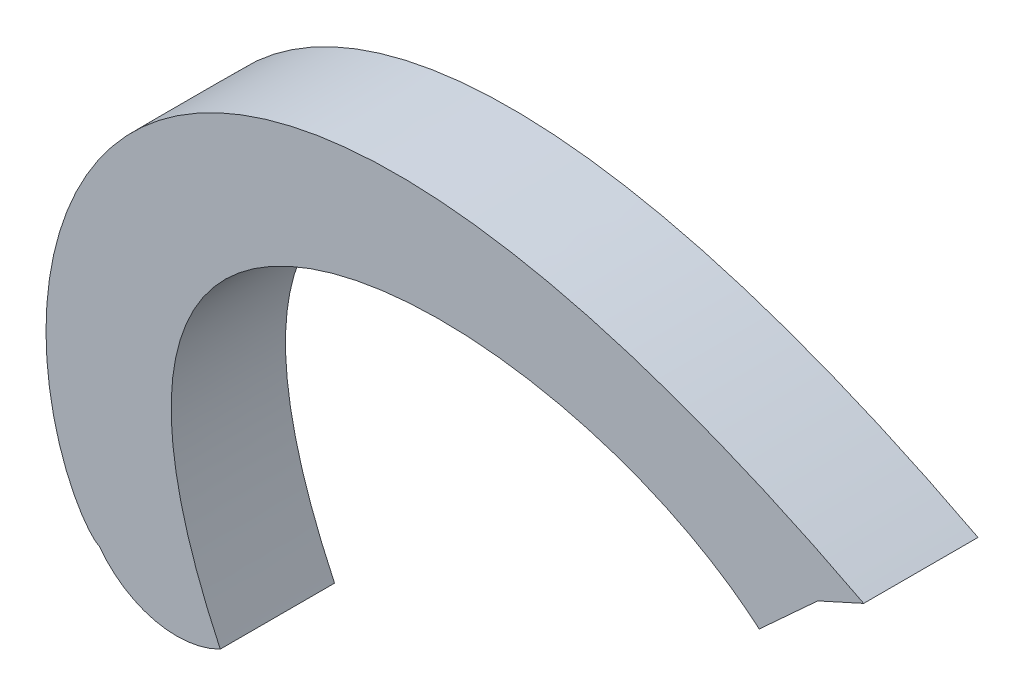
ISO-10303-21;
HEADER;
FILE_DESCRIPTION(('STEP AP214'),'2;1');
FILE_NAME('part.step','',(''),(''),'','','');
FILE_SCHEMA(('AUTOMOTIVE_DESIGN { 1 0 10303 214 1 1 1 1 }'));
ENDSEC;
DATA;
#1=APPLICATION_CONTEXT('core data for automotive mechanical design processes');
#2=APPLICATION_PROTOCOL_DEFINITION('international standard','automotive_design',2000,#1);
#3=PRODUCT_CONTEXT('',#1,'mechanical');
#4=PRODUCT('Part','Part','',(#3));
#5=PRODUCT_RELATED_PRODUCT_CATEGORY('part','',(#4));
#6=PRODUCT_DEFINITION_FORMATION('','',#4);
#7=PRODUCT_DEFINITION_CONTEXT('part definition',#1,'design');
#8=PRODUCT_DEFINITION('design','',#6,#7);
#9=PRODUCT_DEFINITION_SHAPE('','',#8);
#10=(LENGTH_UNIT() NAMED_UNIT(*) SI_UNIT(.MILLI.,.METRE.));
#11=(NAMED_UNIT(*) PLANE_ANGLE_UNIT() SI_UNIT($,.RADIAN.));
#12=(NAMED_UNIT(*) SI_UNIT($,.STERADIAN.) SOLID_ANGLE_UNIT());
#13=UNCERTAINTY_MEASURE_WITH_UNIT(LENGTH_MEASURE(1.E-05),#10,'distance_accuracy_value','');
#14=(GEOMETRIC_REPRESENTATION_CONTEXT(3) GLOBAL_UNCERTAINTY_ASSIGNED_CONTEXT((#13)) GLOBAL_UNIT_ASSIGNED_CONTEXT((#10,
#11,#12)) REPRESENTATION_CONTEXT('',''));
#15=CARTESIAN_POINT('',(0.,0.,0.));
#16=DIRECTION('',(0.,0.,1.));
#17=DIRECTION('',(1.,0.,0.));
#18=AXIS2_PLACEMENT_3D('',#15,#16,#17);
#19=CARTESIAN_POINT('',(-5.88915419968377,-15.9601737152074,13.8159769764135));
#20=CARTESIAN_POINT('',(-36.9486176451294,49.4724972070391,13.8159769764135));
#21=CARTESIAN_POINT('',(41.5171833928002,52.4811360395553,13.8159769764135));
#22=CARTESIAN_POINT('',(72.5490315517939,25.7975068878671,13.8159769764135));
#23=B_SPLINE_CURVE_WITH_KNOTS('',3,(#19,#20,#21,#22),.UNSPECIFIED.,.F.,.F.,(4,4),(0.,1.),.UNSPECIFIED.);
#24=DIRECTION('',(0.,0.,-1.));
#25=VECTOR('',#24,1.);
#26=SURFACE_OF_LINEAR_EXTRUSION('',#23,#25);
#27=CARTESIAN_POINT('',(-5.88915419968377,-15.9601737152074,-2.81602302358649));
#28=CARTESIAN_POINT('',(-36.9486176451294,49.4724972070391,-2.81602302358649));
#29=CARTESIAN_POINT('',(41.5171833928002,52.4811360395553,-2.81602302358649));
#30=CARTESIAN_POINT('',(72.5490315517939,25.7975068878671,-2.81602302358649));
#31=B_SPLINE_CURVE_WITH_KNOTS('',3,(#27,#28,#29,#30),.UNSPECIFIED.,.F.,.F.,(4,4),(0.,1.),.UNSPECIFIED.);
#32=CARTESIAN_POINT('',(-5.88915419968378,-15.9601737152074,-2.81602302358649));
#33=VERTEX_POINT('',#32);
#34=CARTESIAN_POINT('',(72.5490315517939,25.7975068878671,-2.81602302358649));
#35=VERTEX_POINT('',#34);
#36=EDGE_CURVE('E150',#33,#35,#31,.T.);
#37=ORIENTED_EDGE('',*,*,#36,.T.);
#38=DIRECTION('',(0.,0.,-1.));
#39=VECTOR('',#38,1.);
#40=CARTESIAN_POINT('',(72.5490315517939,25.7975068878671,13.8159769764135));
#41=LINE('',#40,#39);
#42=CARTESIAN_POINT('',(72.5490315517939,25.7975068878671,13.8159769764135));
#43=VERTEX_POINT('',#42);
#44=EDGE_CURVE('E11',#43,#35,#41,.T.);
#45=ORIENTED_EDGE('',*,*,#44,.F.);
#46=CARTESIAN_POINT('',(-5.88915419968378,-15.9601737152074,13.8159769764135));
#47=VERTEX_POINT('',#46);
#48=EDGE_CURVE('E166',#47,#43,#23,.T.);
#49=ORIENTED_EDGE('',*,*,#48,.F.);
#50=DIRECTION('',(0.,0.,-1.));
#51=VECTOR('',#50,1.);
#52=CARTESIAN_POINT('',(-5.88915419968378,-15.9601737152074,13.8159769764135));
#53=LINE('',#52,#51);
#54=EDGE_CURVE('E121',#47,#33,#53,.T.);
#55=ORIENTED_EDGE('',*,*,#54,.T.);
#56=EDGE_LOOP('',(#37,#45,#49,#55));
#57=FACE_BOUND('',#56,.T.);
#58=ADVANCED_FACE('F45',(#57),#26,.F.);
#59=CARTESIAN_POINT('',(72.5490315517939,25.7975068878671,13.8159769764135));
#60=DIRECTION('',(-0.675571462147576,0.737294513428512,0.));
#61=DIRECTION('',(-0.737294513428512,-0.675571462147576,0.));
#62=AXIS2_PLACEMENT_3D('',#59,#60,#61);
#63=PLANE('',#62);
#64=DIRECTION('',(0.737294513428512,0.675571462147576,0.));
#65=VECTOR('',#64,1.);
#66=CARTESIAN_POINT('',(72.5490315517939,25.7975068878671,-2.81602302358649));
#67=LINE('',#66,#65);
#68=CARTESIAN_POINT('',(81.0628593167846,33.5985944680816,-2.81602302358649));
#69=VERTEX_POINT('',#68);
#70=EDGE_CURVE('E144',#35,#69,#67,.T.);
#71=ORIENTED_EDGE('',*,*,#70,.T.);
#72=DIRECTION('',(0.,0.,-1.));
#73=VECTOR('',#72,1.);
#74=CARTESIAN_POINT('',(81.0628593167846,33.5985944680816,13.8159769764135));
#75=LINE('',#74,#73);
#76=CARTESIAN_POINT('',(81.0628593167846,33.5985944680816,13.8159769764135));
#77=VERTEX_POINT('',#76);
#78=EDGE_CURVE('E55',#77,#69,#75,.T.);
#79=ORIENTED_EDGE('',*,*,#78,.F.);
#80=DIRECTION('',(0.737294513428512,0.675571462147576,0.));
#81=VECTOR('',#80,1.);
#82=CARTESIAN_POINT('',(72.5490315517939,25.7975068878671,13.8159769764135));
#83=LINE('',#82,#81);
#84=EDGE_CURVE('E97',#43,#77,#83,.T.);
#85=ORIENTED_EDGE('',*,*,#84,.F.);
#86=ORIENTED_EDGE('',*,*,#44,.T.);
#87=EDGE_LOOP('',(#71,#79,#85,#86));
#88=FACE_BOUND('',#87,.T.);
#89=ADVANCED_FACE('F138',(#88),#63,.F.);
#90=CARTESIAN_POINT('',(81.0628593167846,33.5985944680816,13.8159769764135));
#91=DIRECTION('',(-0.412575858176279,0.910923246629543,0.));
#92=DIRECTION('',(-0.910923246629543,-0.412575858176279,0.));
#93=AXIS2_PLACEMENT_3D('',#90,#91,#92);
#94=PLANE('',#93);
#95=DIRECTION('',(0.910923246629543,0.412575858176279,0.));
#96=VECTOR('',#95,1.);
#97=CARTESIAN_POINT('',(81.0628593167846,33.5985944680816,-2.81602302358649));
#98=LINE('',#97,#96);
#99=CARTESIAN_POINT('',(87.7515955527034,36.6280605650987,-2.81602302358649));
#100=VERTEX_POINT('',#99);
#101=EDGE_CURVE('E113',#69,#100,#98,.T.);
#102=ORIENTED_EDGE('',*,*,#101,.T.);
#103=DIRECTION('',(0.,0.,-1.));
#104=VECTOR('',#103,1.);
#105=CARTESIAN_POINT('',(87.7515955527034,36.6280605650987,13.8159769764135));
#106=LINE('',#105,#104);
#107=CARTESIAN_POINT('',(87.7515955527034,36.6280605650987,13.8159769764135));
#108=VERTEX_POINT('',#107);
#109=EDGE_CURVE('E110',#108,#100,#106,.T.);
#110=ORIENTED_EDGE('',*,*,#109,.F.);
#111=DIRECTION('',(0.910923246629543,0.412575858176279,0.));
#112=VECTOR('',#111,1.);
#113=CARTESIAN_POINT('',(81.0628593167846,33.5985944680816,13.8159769764135));
#114=LINE('',#113,#112);
#115=EDGE_CURVE('E101',#77,#108,#114,.T.);
#116=ORIENTED_EDGE('',*,*,#115,.F.);
#117=ORIENTED_EDGE('',*,*,#78,.T.);
#118=EDGE_LOOP('',(#102,#110,#116,#117));
#119=FACE_BOUND('',#118,.T.);
#120=ADVANCED_FACE('F111',(#119),#94,.F.);
#121=CARTESIAN_POINT('',(87.7515955527034,36.6280605650987,13.8159769764135));
#122=CARTESIAN_POINT('',(-22.2952615594618,93.8948110954645,13.8159769764135));
#123=CARTESIAN_POINT('',(-48.9360166501118,23.144332876586,13.8159769764135));
#124=CARTESIAN_POINT('',(-27.7899428822048,-9.99592826001691,13.8159769764135));
#125=CARTESIAN_POINT('',(-23.4719389836452,-11.8005988182349,13.8159769764135));
#126=B_SPLINE_CURVE_WITH_KNOTS('',4,(#121,#122,#123,#124,#125),.UNSPECIFIED.,.F.,.F.,(5,5),(0.,
1.),.UNSPECIFIED.);
#127=DIRECTION('',(0.,0.,-1.));
#128=VECTOR('',#127,1.);
#129=SURFACE_OF_LINEAR_EXTRUSION('',#126,#128);
#130=CARTESIAN_POINT('',(87.7515955527034,36.6280605650987,-2.81602302358649));
#131=CARTESIAN_POINT('',(-22.2952615594618,93.8948110954645,-2.81602302358649));
#132=CARTESIAN_POINT('',(-48.9360166501118,23.144332876586,-2.81602302358649));
#133=CARTESIAN_POINT('',(-27.7899428822048,-9.99592826001691,-2.81602302358649));
#134=CARTESIAN_POINT('',(-23.4719389836452,-11.8005988182349,-2.81602302358649));
#135=B_SPLINE_CURVE_WITH_KNOTS('',4,(#130,#131,#132,#133,#134),.UNSPECIFIED.,.F.,.F.,(5,5),(0.,
1.),.UNSPECIFIED.);
#136=CARTESIAN_POINT('',(-23.4719389836452,-11.8005988182349,-2.81602302358649));
#137=VERTEX_POINT('',#136);
#138=EDGE_CURVE('E83',#100,#137,#135,.T.);
#139=ORIENTED_EDGE('',*,*,#138,.T.);
#140=DIRECTION('',(0.,0.,-1.));
#141=VECTOR('',#140,1.);
#142=CARTESIAN_POINT('',(-23.4719389836452,-11.8005988182349,13.8159769764135));
#143=LINE('',#142,#141);
#144=CARTESIAN_POINT('',(-23.4719389836452,-11.8005988182349,13.8159769764135));
#145=VERTEX_POINT('',#144);
#146=EDGE_CURVE('E115',#145,#137,#143,.T.);
#147=ORIENTED_EDGE('',*,*,#146,.F.);
#148=EDGE_CURVE('E105',#108,#145,#126,.T.);
#149=ORIENTED_EDGE('',*,*,#148,.F.);
#150=ORIENTED_EDGE('',*,*,#109,.T.);
#151=EDGE_LOOP('',(#139,#147,#149,#150));
#152=FACE_BOUND('',#151,.T.);
#153=ADVANCED_FACE('F117',(#152),#129,.F.);
#154=CARTESIAN_POINT('',(-12.2268575605098,-3.5084883612498,13.8159769764135));
#155=DIRECTION('',(0.,0.,-1.));
#156=DIRECTION('',(-1.,0.,0.));
#157=AXIS2_PLACEMENT_3D('',#154,#155,#156);
#158=CYLINDRICAL_SURFACE('',#157,13.9717912968878);
#159=CARTESIAN_POINT('',(-12.2268575605098,-3.5084883612498,-2.81602302358649));
#160=DIRECTION('',(0.,0.,1.));
#161=DIRECTION('',(1.,0.,0.));
#162=AXIS2_PLACEMENT_3D('',#159,#160,#161);
#163=CIRCLE('',#162,13.9717912968878);
#164=EDGE_CURVE('E89',#137,#33,#163,.T.);
#165=ORIENTED_EDGE('',*,*,#164,.T.);
#166=ORIENTED_EDGE('',*,*,#54,.F.);
#167=CARTESIAN_POINT('',(-12.2268575605098,-3.5084883612498,13.8159769764135));
#168=DIRECTION('',(0.,0.,1.));
#169=DIRECTION('',(1.,0.,0.));
#170=AXIS2_PLACEMENT_3D('',#167,#168,#169);
#171=CIRCLE('',#170,13.9717912968878);
#172=EDGE_CURVE('E63',#145,#47,#171,.T.);
#173=ORIENTED_EDGE('',*,*,#172,.F.);
#174=ORIENTED_EDGE('',*,*,#146,.T.);
#175=EDGE_LOOP('',(#165,#166,#173,#174));
#176=FACE_BOUND('',#175,.T.);
#177=ADVANCED_FACE('F135',(#176),#158,.T.);
#178=CARTESIAN_POINT('',(10.0456968243903,39.4622791140554,13.8159769764135));
#179=DIRECTION('',(0.,0.,1.));
#180=DIRECTION('',(1.,0.,0.));
#181=AXIS2_PLACEMENT_3D('',#178,#179,#180);
#182=PLANE('',#181);
#183=ORIENTED_EDGE('',*,*,#48,.T.);
#184=ORIENTED_EDGE('',*,*,#84,.T.);
#185=ORIENTED_EDGE('',*,*,#115,.T.);
#186=ORIENTED_EDGE('',*,*,#148,.T.);
#187=ORIENTED_EDGE('',*,*,#172,.T.);
#188=EDGE_LOOP('',(#183,#184,#185,#186,#187));
#189=FACE_BOUND('',#188,.T.);
#190=ADVANCED_FACE('F103',(#189),#182,.T.);
#191=CARTESIAN_POINT('',(10.0456968243903,39.4622791140554,-2.81602302358649));
#192=DIRECTION('',(0.,0.,1.));
#193=DIRECTION('',(1.,0.,0.));
#194=AXIS2_PLACEMENT_3D('',#191,#192,#193);
#195=PLANE('',#194);
#196=ORIENTED_EDGE('',*,*,#36,.F.);
#197=ORIENTED_EDGE('',*,*,#164,.F.);
#198=ORIENTED_EDGE('',*,*,#138,.F.);
#199=ORIENTED_EDGE('',*,*,#101,.F.);
#200=ORIENTED_EDGE('',*,*,#70,.F.);
#201=EDGE_LOOP('',(#196,#197,#198,#199,#200));
#202=FACE_BOUND('',#201,.T.);
#203=ADVANCED_FACE('F153',(#202),#195,.F.);
#204=CLOSED_SHELL('',(#58,#89,#120,#153,#177,#190,#203));
#205=MANIFOLD_SOLID_BREP('B2',#204);
#206=ADVANCED_BREP_SHAPE_REPRESENTATION('',(#18,#205),#14);
#207=SHAPE_DEFINITION_REPRESENTATION(#9,#206);
ENDSEC;
END-ISO-10303-21;
